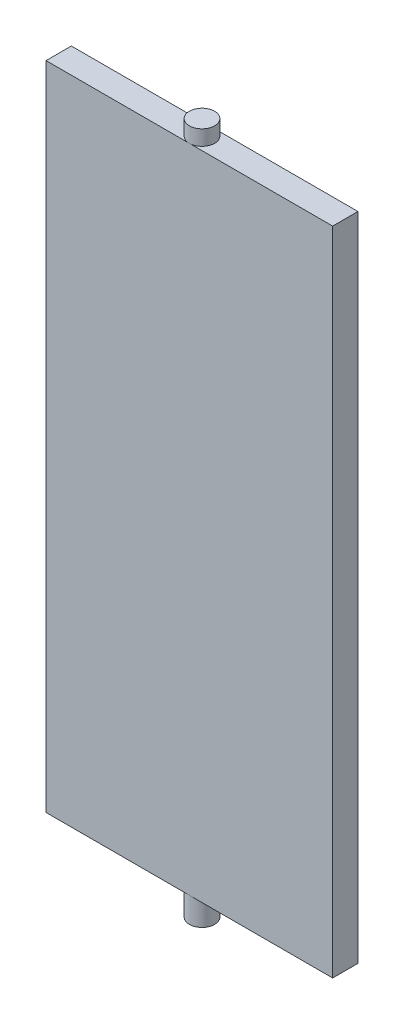
ISO-10303-21;
HEADER;
FILE_DESCRIPTION(('STEP AP214'),'2;1');
FILE_NAME('part.step','',(''),(''),'','','');
FILE_SCHEMA(('AUTOMOTIVE_DESIGN { 1 0 10303 214 1 1 1 1 }'));
ENDSEC;
DATA;
#1=APPLICATION_CONTEXT('core data for automotive mechanical design processes');
#2=APPLICATION_PROTOCOL_DEFINITION('international standard','automotive_design',2000,#1);
#3=PRODUCT_CONTEXT('',#1,'mechanical');
#4=PRODUCT('Part','Part','',(#3));
#5=PRODUCT_RELATED_PRODUCT_CATEGORY('part','',(#4));
#6=PRODUCT_DEFINITION_FORMATION('','',#4);
#7=PRODUCT_DEFINITION_CONTEXT('part definition',#1,'design');
#8=PRODUCT_DEFINITION('design','',#6,#7);
#9=PRODUCT_DEFINITION_SHAPE('','',#8);
#10=(LENGTH_UNIT() NAMED_UNIT(*) SI_UNIT(.MILLI.,.METRE.));
#11=(NAMED_UNIT(*) PLANE_ANGLE_UNIT() SI_UNIT($,.RADIAN.));
#12=(NAMED_UNIT(*) SI_UNIT($,.STERADIAN.) SOLID_ANGLE_UNIT());
#13=UNCERTAINTY_MEASURE_WITH_UNIT(LENGTH_MEASURE(1.E-05),#10,'distance_accuracy_value','');
#14=(GEOMETRIC_REPRESENTATION_CONTEXT(3) GLOBAL_UNCERTAINTY_ASSIGNED_CONTEXT((#13)) GLOBAL_UNIT_ASSIGNED_CONTEXT((#10,
#11,#12)) REPRESENTATION_CONTEXT('',''));
#15=CARTESIAN_POINT('',(0.,0.,0.));
#16=DIRECTION('',(0.,0.,1.));
#17=DIRECTION('',(1.,0.,0.));
#18=AXIS2_PLACEMENT_3D('',#15,#16,#17);
#19=CARTESIAN_POINT('',(0.,0.,3.));
#20=DIRECTION('',(0.,1.,0.));
#21=DIRECTION('',(0.,0.,1.));
#22=AXIS2_PLACEMENT_3D('',#19,#20,#21);
#23=PLANE('',#22);
#24=DIRECTION('',(1.,0.,0.));
#25=VECTOR('',#24,1.);
#26=CARTESIAN_POINT('',(0.,0.,3.));
#27=LINE('',#26,#25);
#28=CARTESIAN_POINT('',(-17.,0.,3.));
#29=VERTEX_POINT('',#28);
#30=CARTESIAN_POINT('',(0.,0.,3.));
#31=VERTEX_POINT('',#30);
#32=EDGE_CURVE('E109',#29,#31,#27,.T.);
#33=ORIENTED_EDGE('',*,*,#32,.F.);
#34=CARTESIAN_POINT('',(-17.,0.,1.5));
#35=DIRECTION('',(0.,1.,0.));
#36=DIRECTION('',(0.,0.,1.));
#37=AXIS2_PLACEMENT_3D('',#34,#35,#36);
#38=CIRCLE('',#37,1.5);
#39=CARTESIAN_POINT('',(-17.,0.,0.));
#40=VERTEX_POINT('',#39);
#41=EDGE_CURVE('E59',#29,#40,#38,.T.);
#42=ORIENTED_EDGE('',*,*,#41,.T.);
#43=DIRECTION('',(1.,0.,0.));
#44=VECTOR('',#43,1.);
#45=CARTESIAN_POINT('',(0.,0.,0.));
#46=LINE('',#45,#44);
#47=CARTESIAN_POINT('',(0.,0.,0.));
#48=VERTEX_POINT('',#47);
#49=EDGE_CURVE('E107',#40,#48,#46,.T.);
#50=ORIENTED_EDGE('',*,*,#49,.T.);
#51=DIRECTION('',(0.,0.,-1.));
#52=VECTOR('',#51,1.);
#53=CARTESIAN_POINT('',(0.,0.,3.));
#54=LINE('',#53,#52);
#55=EDGE_CURVE('E51',#31,#48,#54,.T.);
#56=ORIENTED_EDGE('',*,*,#55,.F.);
#57=EDGE_LOOP('',(#33,#42,#50,#56));
#58=FACE_BOUND('',#57,.T.);
#59=ADVANCED_FACE('F47',(#58),#23,.F.);
#60=CARTESIAN_POINT('',(0.,77.25,3.));
#61=DIRECTION('',(0.,-1.,0.));
#62=DIRECTION('',(0.,0.,-1.));
#63=AXIS2_PLACEMENT_3D('',#60,#61,#62);
#64=PLANE('',#63);
#65=CARTESIAN_POINT('',(-17.,77.25,1.5));
#66=DIRECTION('',(0.,1.,0.));
#67=DIRECTION('',(0.,0.,1.));
#68=AXIS2_PLACEMENT_3D('',#65,#66,#67);
#69=CIRCLE('',#68,1.5);
#70=CARTESIAN_POINT('',(-17.,77.25,3.));
#71=VERTEX_POINT('',#70);
#72=CARTESIAN_POINT('',(-17.,77.25,0.));
#73=VERTEX_POINT('',#72);
#74=EDGE_CURVE('E158',#71,#73,#69,.T.);
#75=ORIENTED_EDGE('',*,*,#74,.F.);
#76=DIRECTION('',(-1.,0.,0.));
#77=VECTOR('',#76,1.);
#78=CARTESIAN_POINT('',(0.,77.25,3.));
#79=LINE('',#78,#77);
#80=CARTESIAN_POINT('',(0.,77.25,3.));
#81=VERTEX_POINT('',#80);
#82=EDGE_CURVE('E292',#81,#71,#79,.T.);
#83=ORIENTED_EDGE('',*,*,#82,.F.);
#84=DIRECTION('',(0.,0.,-1.));
#85=VECTOR('',#84,1.);
#86=CARTESIAN_POINT('',(0.,77.25,3.));
#87=LINE('',#86,#85);
#88=CARTESIAN_POINT('',(0.,77.25,0.));
#89=VERTEX_POINT('',#88);
#90=EDGE_CURVE('E147',#81,#89,#87,.T.);
#91=ORIENTED_EDGE('',*,*,#90,.T.);
#92=DIRECTION('',(-1.,0.,0.));
#93=VECTOR('',#92,1.);
#94=CARTESIAN_POINT('',(0.,77.25,0.));
#95=LINE('',#94,#93);
#96=EDGE_CURVE('E135',#89,#73,#95,.T.);
#97=ORIENTED_EDGE('',*,*,#96,.T.);
#98=EDGE_LOOP('',(#75,#83,#91,#97));
#99=FACE_BOUND('',#98,.T.);
#100=ADVANCED_FACE('F182',(#99),#64,.F.);
#101=CARTESIAN_POINT('',(-34.,0.,0.));
#102=VERTEX_POINT('',#101);
#103=EDGE_CURVE('E117',#102,#40,#46,.T.);
#104=ORIENTED_EDGE('',*,*,#103,.T.);
#105=EDGE_CURVE('E11',#40,#29,#38,.T.);
#106=ORIENTED_EDGE('',*,*,#105,.T.);
#107=CARTESIAN_POINT('',(-34.,0.,3.));
#108=VERTEX_POINT('',#107);
#109=EDGE_CURVE('E284',#108,#29,#27,.T.);
#110=ORIENTED_EDGE('',*,*,#109,.F.);
#111=DIRECTION('',(0.,0.,-1.));
#112=VECTOR('',#111,1.);
#113=CARTESIAN_POINT('',(-34.,0.,3.));
#114=LINE('',#113,#112);
#115=EDGE_CURVE('E126',#108,#102,#114,.T.);
#116=ORIENTED_EDGE('',*,*,#115,.T.);
#117=EDGE_LOOP('',(#104,#106,#110,#116));
#118=FACE_BOUND('',#117,.T.);
#119=ADVANCED_FACE('F49',(#118),#23,.F.);
#120=CARTESIAN_POINT('',(0.,0.,3.));
#121=DIRECTION('',(-1.,0.,0.));
#122=DIRECTION('',(0.,0.,1.));
#123=AXIS2_PLACEMENT_3D('',#120,#121,#122);
#124=PLANE('',#123);
#125=DIRECTION('',(0.,1.,0.));
#126=VECTOR('',#125,1.);
#127=CARTESIAN_POINT('',(0.,0.,0.));
#128=LINE('',#127,#126);
#129=EDGE_CURVE('E119',#48,#89,#128,.T.);
#130=ORIENTED_EDGE('',*,*,#129,.T.);
#131=ORIENTED_EDGE('',*,*,#90,.F.);
#132=DIRECTION('',(0.,1.,0.));
#133=VECTOR('',#132,1.);
#134=CARTESIAN_POINT('',(0.,0.,3.));
#135=LINE('',#134,#133);
#136=EDGE_CURVE('E287',#31,#81,#135,.T.);
#137=ORIENTED_EDGE('',*,*,#136,.F.);
#138=ORIENTED_EDGE('',*,*,#55,.T.);
#139=EDGE_LOOP('',(#130,#131,#137,#138));
#140=FACE_BOUND('',#139,.T.);
#141=ADVANCED_FACE('F190',(#140),#124,.F.);
#142=EDGE_CURVE('E57',#73,#71,#69,.T.);
#143=ORIENTED_EDGE('',*,*,#142,.F.);
#144=CARTESIAN_POINT('',(-34.,77.25,0.));
#145=VERTEX_POINT('',#144);
#146=EDGE_CURVE('E129',#73,#145,#95,.T.);
#147=ORIENTED_EDGE('',*,*,#146,.T.);
#148=DIRECTION('',(0.,0.,-1.));
#149=VECTOR('',#148,1.);
#150=CARTESIAN_POINT('',(-34.,77.25,3.));
#151=LINE('',#150,#149);
#152=CARTESIAN_POINT('',(-34.,77.25,3.));
#153=VERTEX_POINT('',#152);
#154=EDGE_CURVE('E144',#153,#145,#151,.T.);
#155=ORIENTED_EDGE('',*,*,#154,.F.);
#156=EDGE_CURVE('E290',#71,#153,#79,.T.);
#157=ORIENTED_EDGE('',*,*,#156,.F.);
#158=EDGE_LOOP('',(#143,#147,#155,#157));
#159=FACE_BOUND('',#158,.T.);
#160=ADVANCED_FACE('F189',(#159),#64,.F.);
#161=CARTESIAN_POINT('',(-34.,0.,3.));
#162=DIRECTION('',(1.,0.,0.));
#163=DIRECTION('',(0.,0.,-1.));
#164=AXIS2_PLACEMENT_3D('',#161,#162,#163);
#165=PLANE('',#164);
#166=DIRECTION('',(0.,-1.,0.));
#167=VECTOR('',#166,1.);
#168=CARTESIAN_POINT('',(-34.,0.,0.));
#169=LINE('',#168,#167);
#170=EDGE_CURVE('E139',#145,#102,#169,.T.);
#171=ORIENTED_EDGE('',*,*,#170,.T.);
#172=ORIENTED_EDGE('',*,*,#115,.F.);
#173=DIRECTION('',(0.,-1.,0.));
#174=VECTOR('',#173,1.);
#175=CARTESIAN_POINT('',(-34.,0.,3.));
#176=LINE('',#175,#174);
#177=EDGE_CURVE('E132',#153,#108,#176,.T.);
#178=ORIENTED_EDGE('',*,*,#177,.F.);
#179=ORIENTED_EDGE('',*,*,#154,.T.);
#180=EDGE_LOOP('',(#171,#172,#178,#179));
#181=FACE_BOUND('',#180,.T.);
#182=ADVANCED_FACE('F199',(#181),#165,.F.);
#183=CARTESIAN_POINT('',(0.,0.,3.));
#184=DIRECTION('',(0.,0.,-1.));
#185=DIRECTION('',(-1.,0.,0.));
#186=AXIS2_PLACEMENT_3D('',#183,#184,#185);
#187=PLANE('',#186);
#188=ORIENTED_EDGE('',*,*,#109,.T.);
#189=ORIENTED_EDGE('',*,*,#32,.T.);
#190=ORIENTED_EDGE('',*,*,#136,.T.);
#191=ORIENTED_EDGE('',*,*,#82,.T.);
#192=ORIENTED_EDGE('',*,*,#156,.T.);
#193=ORIENTED_EDGE('',*,*,#177,.T.);
#194=EDGE_LOOP('',(#188,#189,#190,#191,#192,#193));
#195=FACE_BOUND('',#194,.T.);
#196=ADVANCED_FACE('F202',(#195),#187,.F.);
#197=CARTESIAN_POINT('',(0.,0.,0.));
#198=DIRECTION('',(0.,0.,-1.));
#199=DIRECTION('',(-1.,0.,0.));
#200=AXIS2_PLACEMENT_3D('',#197,#198,#199);
#201=PLANE('',#200);
#202=ORIENTED_EDGE('',*,*,#103,.F.);
#203=ORIENTED_EDGE('',*,*,#170,.F.);
#204=ORIENTED_EDGE('',*,*,#146,.F.);
#205=ORIENTED_EDGE('',*,*,#96,.F.);
#206=ORIENTED_EDGE('',*,*,#129,.F.);
#207=ORIENTED_EDGE('',*,*,#49,.F.);
#208=EDGE_LOOP('',(#202,#203,#204,#205,#206,#207));
#209=FACE_BOUND('',#208,.T.);
#210=ADVANCED_FACE('F115',(#209),#201,.T.);
#211=CARTESIAN_POINT('',(-17.,79.05,1.5));
#212=DIRECTION('',(0.,-1.,0.));
#213=DIRECTION('',(0.,0.,-1.));
#214=AXIS2_PLACEMENT_3D('',#211,#212,#213);
#215=CYLINDRICAL_SURFACE('',#214,1.5);
#216=CARTESIAN_POINT('',(-17.,79.05,1.5));
#217=DIRECTION('',(0.,1.,0.));
#218=DIRECTION('',(0.,0.,1.));
#219=AXIS2_PLACEMENT_3D('',#216,#217,#218);
#220=CIRCLE('',#219,1.5);
#221=CARTESIAN_POINT('',(-17.,79.05,3.));
#222=VERTEX_POINT('',#221);
#223=EDGE_CURVE('E122',#222,#222,#220,.T.);
#224=ORIENTED_EDGE('',*,*,#223,.F.);
#225=EDGE_LOOP('',(#224));
#226=FACE_BOUND('',#225,.T.);
#227=ORIENTED_EDGE('',*,*,#74,.T.);
#228=ORIENTED_EDGE('',*,*,#142,.T.);
#229=EDGE_LOOP('',(#227,#228));
#230=FACE_BOUND('',#229,.T.);
#231=ADVANCED_FACE('F206',(#226,#230),#215,.T.);
#232=CARTESIAN_POINT('',(0.,79.05,0.));
#233=DIRECTION('',(0.,1.,0.));
#234=DIRECTION('',(0.,0.,1.));
#235=AXIS2_PLACEMENT_3D('',#232,#233,#234);
#236=PLANE('',#235);
#237=ORIENTED_EDGE('',*,*,#223,.T.);
#238=EDGE_LOOP('',(#237));
#239=FACE_BOUND('',#238,.T.);
#240=ADVANCED_FACE('F179',(#239),#236,.T.);
#241=CARTESIAN_POINT('',(-17.,-3.,1.5));
#242=DIRECTION('',(0.,1.,0.));
#243=DIRECTION('',(0.,0.,1.));
#244=AXIS2_PLACEMENT_3D('',#241,#242,#243);
#245=CYLINDRICAL_SURFACE('',#244,1.5);
#246=CARTESIAN_POINT('',(-17.,-3.,1.5));
#247=DIRECTION('',(0.,1.,0.));
#248=DIRECTION('',(0.,0.,1.));
#249=AXIS2_PLACEMENT_3D('',#246,#247,#248);
#250=CIRCLE('',#249,1.5);
#251=CARTESIAN_POINT('',(-17.,-3.,3.));
#252=VERTEX_POINT('',#251);
#253=EDGE_CURVE('E112',#252,#252,#250,.T.);
#254=ORIENTED_EDGE('',*,*,#253,.T.);
#255=EDGE_LOOP('',(#254));
#256=FACE_BOUND('',#255,.T.);
#257=ORIENTED_EDGE('',*,*,#41,.F.);
#258=ORIENTED_EDGE('',*,*,#105,.F.);
#259=EDGE_LOOP('',(#257,#258));
#260=FACE_BOUND('',#259,.T.);
#261=ADVANCED_FACE('F99',(#256,#260),#245,.T.);
#262=CARTESIAN_POINT('',(-17.,-3.,1.5));
#263=DIRECTION('',(0.,1.,0.));
#264=DIRECTION('',(0.,0.,1.));
#265=AXIS2_PLACEMENT_3D('',#262,#263,#264);
#266=PLANE('',#265);
#267=ORIENTED_EDGE('',*,*,#253,.F.);
#268=EDGE_LOOP('',(#267));
#269=FACE_BOUND('',#268,.T.);
#270=ADVANCED_FACE('F173',(#269),#266,.F.);
#271=CLOSED_SHELL('',(#59,#100,#119,#141,#160,#182,#196,#210,#231,#240,#261,#270));
#272=MANIFOLD_SOLID_BREP('B2',#271);
#273=ADVANCED_BREP_SHAPE_REPRESENTATION('',(#18,#272),#14);
#274=SHAPE_DEFINITION_REPRESENTATION(#9,#273);
ENDSEC;
END-ISO-10303-21;
